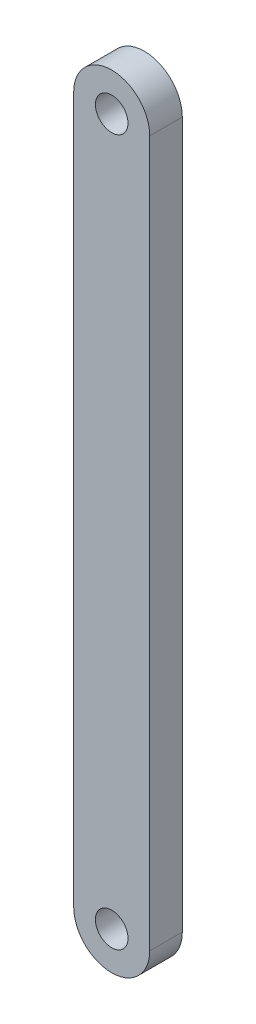
ISO-10303-21;
HEADER;
FILE_DESCRIPTION(('STEP AP214'),'2;1');
FILE_NAME('part.step','',(''),(''),'','','');
FILE_SCHEMA(('AUTOMOTIVE_DESIGN { 1 0 10303 214 1 1 1 1 }'));
ENDSEC;
DATA;
#1=APPLICATION_CONTEXT('core data for automotive mechanical design processes');
#2=APPLICATION_PROTOCOL_DEFINITION('international standard','automotive_design',2000,#1);
#3=PRODUCT_CONTEXT('',#1,'mechanical');
#4=PRODUCT('Part','Part','',(#3));
#5=PRODUCT_RELATED_PRODUCT_CATEGORY('part','',(#4));
#6=PRODUCT_DEFINITION_FORMATION('','',#4);
#7=PRODUCT_DEFINITION_CONTEXT('part definition',#1,'design');
#8=PRODUCT_DEFINITION('design','',#6,#7);
#9=PRODUCT_DEFINITION_SHAPE('','',#8);
#10=(LENGTH_UNIT() NAMED_UNIT(*) SI_UNIT(.MILLI.,.METRE.));
#11=(NAMED_UNIT(*) PLANE_ANGLE_UNIT() SI_UNIT($,.RADIAN.));
#12=(NAMED_UNIT(*) SI_UNIT($,.STERADIAN.) SOLID_ANGLE_UNIT());
#13=UNCERTAINTY_MEASURE_WITH_UNIT(LENGTH_MEASURE(1.E-05),#10,'distance_accuracy_value','');
#14=(GEOMETRIC_REPRESENTATION_CONTEXT(3) GLOBAL_UNCERTAINTY_ASSIGNED_CONTEXT((#13)) GLOBAL_UNIT_ASSIGNED_CONTEXT((#10,
#11,#12)) REPRESENTATION_CONTEXT('',''));
#15=CARTESIAN_POINT('',(0.,0.,0.));
#16=DIRECTION('',(0.,0.,1.));
#17=DIRECTION('',(1.,0.,0.));
#18=AXIS2_PLACEMENT_3D('',#15,#16,#17);
#19=CARTESIAN_POINT('',(0.,32.5,1.5));
#20=DIRECTION('',(0.,0.,1.));
#21=DIRECTION('',(1.,0.,0.));
#22=AXIS2_PLACEMENT_3D('',#19,#20,#21);
#23=PLANE('',#22);
#24=CARTESIAN_POINT('',(0.,-32.5,1.5));
#25=DIRECTION('',(0.,0.,1.));
#26=DIRECTION('',(1.,0.,0.));
#27=AXIS2_PLACEMENT_3D('',#24,#25,#26);
#28=CIRCLE('',#27,1.5);
#29=CARTESIAN_POINT('',(1.50000000000001,-32.5,1.5));
#30=VERTEX_POINT('',#29);
#31=EDGE_CURVE('E104',#30,#30,#28,.T.);
#32=ORIENTED_EDGE('',*,*,#31,.F.);
#33=EDGE_LOOP('',(#32));
#34=FACE_BOUND('',#33,.T.);
#35=CARTESIAN_POINT('',(0.,32.5,1.5));
#36=DIRECTION('',(0.,0.,1.));
#37=DIRECTION('',(1.,0.,0.));
#38=AXIS2_PLACEMENT_3D('',#35,#36,#37);
#39=CIRCLE('',#38,3.5);
#40=CARTESIAN_POINT('',(3.49999999999999,32.5,1.5));
#41=VERTEX_POINT('',#40);
#42=CARTESIAN_POINT('',(-3.50000000000001,32.5,1.5));
#43=VERTEX_POINT('',#42);
#44=EDGE_CURVE('E89',#41,#43,#39,.T.);
#45=ORIENTED_EDGE('',*,*,#44,.T.);
#46=DIRECTION('',(0.,-1.,0.));
#47=VECTOR('',#46,1.);
#48=CARTESIAN_POINT('',(-3.50000000000001,32.5,1.5));
#49=LINE('',#48,#47);
#50=CARTESIAN_POINT('',(-3.49999999999999,-32.5,1.5));
#51=VERTEX_POINT('',#50);
#52=EDGE_CURVE('E84',#43,#51,#49,.T.);
#53=ORIENTED_EDGE('',*,*,#52,.T.);
#54=CARTESIAN_POINT('',(0.,-32.5,1.5));
#55=DIRECTION('',(0.,0.,1.));
#56=DIRECTION('',(1.,0.,0.));
#57=AXIS2_PLACEMENT_3D('',#54,#55,#56);
#58=CIRCLE('',#57,3.5);
#59=CARTESIAN_POINT('',(3.50000000000001,-32.5,1.5));
#60=VERTEX_POINT('',#59);
#61=EDGE_CURVE('E87',#51,#60,#58,.T.);
#62=ORIENTED_EDGE('',*,*,#61,.T.);
#63=DIRECTION('',(0.,1.,0.));
#64=VECTOR('',#63,1.);
#65=CARTESIAN_POINT('',(3.49999999999999,32.5,1.5));
#66=LINE('',#65,#64);
#67=EDGE_CURVE('E54',#60,#41,#66,.T.);
#68=ORIENTED_EDGE('',*,*,#67,.T.);
#69=EDGE_LOOP('',(#45,#53,#62,#68));
#70=FACE_BOUND('',#69,.T.);
#71=CARTESIAN_POINT('',(0.,32.5,1.5));
#72=DIRECTION('',(0.,0.,1.));
#73=DIRECTION('',(1.,0.,0.));
#74=AXIS2_PLACEMENT_3D('',#71,#72,#73);
#75=CIRCLE('',#74,1.5);
#76=CARTESIAN_POINT('',(1.49999999999999,32.5,1.5));
#77=VERTEX_POINT('',#76);
#78=EDGE_CURVE('E119',#77,#77,#75,.T.);
#79=ORIENTED_EDGE('',*,*,#78,.F.);
#80=EDGE_LOOP('',(#79));
#81=FACE_BOUND('',#80,.T.);
#82=ADVANCED_FACE('F37',(#34,#70,#81),#23,.T.);
#83=CARTESIAN_POINT('',(0.,32.5,-1.5));
#84=DIRECTION('',(0.,0.,1.));
#85=DIRECTION('',(1.,0.,0.));
#86=AXIS2_PLACEMENT_3D('',#83,#84,#85);
#87=PLANE('',#86);
#88=CARTESIAN_POINT('',(0.,32.5,-1.5));
#89=DIRECTION('',(0.,0.,1.));
#90=DIRECTION('',(1.,0.,0.));
#91=AXIS2_PLACEMENT_3D('',#88,#89,#90);
#92=CIRCLE('',#91,3.5);
#93=CARTESIAN_POINT('',(3.49999999999999,32.5,-1.5));
#94=VERTEX_POINT('',#93);
#95=CARTESIAN_POINT('',(-3.50000000000001,32.5,-1.5));
#96=VERTEX_POINT('',#95);
#97=EDGE_CURVE('E101',#94,#96,#92,.T.);
#98=ORIENTED_EDGE('',*,*,#97,.F.);
#99=DIRECTION('',(0.,1.,0.));
#100=VECTOR('',#99,1.);
#101=CARTESIAN_POINT('',(3.49999999999999,32.5,-1.5));
#102=LINE('',#101,#100);
#103=CARTESIAN_POINT('',(3.50000000000001,-32.5,-1.5));
#104=VERTEX_POINT('',#103);
#105=EDGE_CURVE('E77',#104,#94,#102,.T.);
#106=ORIENTED_EDGE('',*,*,#105,.F.);
#107=CARTESIAN_POINT('',(0.,-32.5,-1.5));
#108=DIRECTION('',(0.,0.,1.));
#109=DIRECTION('',(1.,0.,0.));
#110=AXIS2_PLACEMENT_3D('',#107,#108,#109);
#111=CIRCLE('',#110,3.5);
#112=CARTESIAN_POINT('',(-3.49999999999999,-32.5,-1.5));
#113=VERTEX_POINT('',#112);
#114=EDGE_CURVE('E71',#113,#104,#111,.T.);
#115=ORIENTED_EDGE('',*,*,#114,.F.);
#116=DIRECTION('',(0.,-1.,0.));
#117=VECTOR('',#116,1.);
#118=CARTESIAN_POINT('',(-3.50000000000001,32.5,-1.5));
#119=LINE('',#118,#117);
#120=EDGE_CURVE('E93',#96,#113,#119,.T.);
#121=ORIENTED_EDGE('',*,*,#120,.F.);
#122=EDGE_LOOP('',(#98,#106,#115,#121));
#123=FACE_BOUND('',#122,.T.);
#124=CARTESIAN_POINT('',(0.,-32.5,-1.5));
#125=DIRECTION('',(0.,0.,1.));
#126=DIRECTION('',(1.,0.,0.));
#127=AXIS2_PLACEMENT_3D('',#124,#125,#126);
#128=CIRCLE('',#127,1.5);
#129=CARTESIAN_POINT('',(1.50000000000001,-32.5,-1.5));
#130=VERTEX_POINT('',#129);
#131=EDGE_CURVE('E116',#130,#130,#128,.T.);
#132=ORIENTED_EDGE('',*,*,#131,.T.);
#133=EDGE_LOOP('',(#132));
#134=FACE_BOUND('',#133,.T.);
#135=CARTESIAN_POINT('',(0.,32.5,-1.5));
#136=DIRECTION('',(0.,0.,1.));
#137=DIRECTION('',(1.,0.,0.));
#138=AXIS2_PLACEMENT_3D('',#135,#136,#137);
#139=CIRCLE('',#138,1.5);
#140=CARTESIAN_POINT('',(1.49999999999999,32.5,-1.5));
#141=VERTEX_POINT('',#140);
#142=EDGE_CURVE('E122',#141,#141,#139,.T.);
#143=ORIENTED_EDGE('',*,*,#142,.T.);
#144=EDGE_LOOP('',(#143));
#145=FACE_BOUND('',#144,.T.);
#146=ADVANCED_FACE('F112',(#123,#134,#145),#87,.F.);
#147=CARTESIAN_POINT('',(0.,32.5,1.5));
#148=DIRECTION('',(0.,0.,-1.));
#149=DIRECTION('',(-1.,0.,0.));
#150=AXIS2_PLACEMENT_3D('',#147,#148,#149);
#151=CYLINDRICAL_SURFACE('',#150,3.5);
#152=ORIENTED_EDGE('',*,*,#97,.T.);
#153=DIRECTION('',(0.,0.,-1.));
#154=VECTOR('',#153,1.);
#155=CARTESIAN_POINT('',(-3.50000000000001,32.5,1.5));
#156=LINE('',#155,#154);
#157=EDGE_CURVE('E11',#43,#96,#156,.T.);
#158=ORIENTED_EDGE('',*,*,#157,.F.);
#159=ORIENTED_EDGE('',*,*,#44,.F.);
#160=DIRECTION('',(0.,0.,-1.));
#161=VECTOR('',#160,1.);
#162=CARTESIAN_POINT('',(3.49999999999999,32.5,1.5));
#163=LINE('',#162,#161);
#164=EDGE_CURVE('E97',#41,#94,#163,.T.);
#165=ORIENTED_EDGE('',*,*,#164,.T.);
#166=EDGE_LOOP('',(#152,#158,#159,#165));
#167=FACE_BOUND('',#166,.T.);
#168=ADVANCED_FACE('F39',(#167),#151,.T.);
#169=CARTESIAN_POINT('',(-3.50000000000001,32.5,1.5));
#170=DIRECTION('',(1.,0.,0.));
#171=DIRECTION('',(0.,1.,0.));
#172=AXIS2_PLACEMENT_3D('',#169,#170,#171);
#173=PLANE('',#172);
#174=ORIENTED_EDGE('',*,*,#120,.T.);
#175=DIRECTION('',(0.,0.,-1.));
#176=VECTOR('',#175,1.);
#177=CARTESIAN_POINT('',(-3.49999999999999,-32.5,1.5));
#178=LINE('',#177,#176);
#179=EDGE_CURVE('E46',#51,#113,#178,.T.);
#180=ORIENTED_EDGE('',*,*,#179,.F.);
#181=ORIENTED_EDGE('',*,*,#52,.F.);
#182=ORIENTED_EDGE('',*,*,#157,.T.);
#183=EDGE_LOOP('',(#174,#180,#181,#182));
#184=FACE_BOUND('',#183,.T.);
#185=ADVANCED_FACE('F92',(#184),#173,.F.);
#186=CARTESIAN_POINT('',(0.,-32.5,1.5));
#187=DIRECTION('',(0.,0.,-1.));
#188=DIRECTION('',(-1.,0.,0.));
#189=AXIS2_PLACEMENT_3D('',#186,#187,#188);
#190=CYLINDRICAL_SURFACE('',#189,3.5);
#191=ORIENTED_EDGE('',*,*,#114,.T.);
#192=DIRECTION('',(0.,0.,-1.));
#193=VECTOR('',#192,1.);
#194=CARTESIAN_POINT('',(3.50000000000001,-32.5,1.5));
#195=LINE('',#194,#193);
#196=EDGE_CURVE('E94',#60,#104,#195,.T.);
#197=ORIENTED_EDGE('',*,*,#196,.F.);
#198=ORIENTED_EDGE('',*,*,#61,.F.);
#199=ORIENTED_EDGE('',*,*,#179,.T.);
#200=EDGE_LOOP('',(#191,#197,#198,#199));
#201=FACE_BOUND('',#200,.T.);
#202=ADVANCED_FACE('F95',(#201),#190,.T.);
#203=CARTESIAN_POINT('',(3.49999999999999,32.5,1.5));
#204=DIRECTION('',(-1.,0.,0.));
#205=DIRECTION('',(0.,-1.,0.));
#206=AXIS2_PLACEMENT_3D('',#203,#204,#205);
#207=PLANE('',#206);
#208=ORIENTED_EDGE('',*,*,#105,.T.);
#209=ORIENTED_EDGE('',*,*,#164,.F.);
#210=ORIENTED_EDGE('',*,*,#67,.F.);
#211=ORIENTED_EDGE('',*,*,#196,.T.);
#212=EDGE_LOOP('',(#208,#209,#210,#211));
#213=FACE_BOUND('',#212,.T.);
#214=ADVANCED_FACE('F109',(#213),#207,.F.);
#215=CARTESIAN_POINT('',(0.,-32.5,1.5));
#216=DIRECTION('',(0.,0.,-1.));
#217=DIRECTION('',(-1.,0.,0.));
#218=AXIS2_PLACEMENT_3D('',#215,#216,#217);
#219=CYLINDRICAL_SURFACE('',#218,1.5);
#220=ORIENTED_EDGE('',*,*,#31,.T.);
#221=EDGE_LOOP('',(#220));
#222=FACE_BOUND('',#221,.T.);
#223=ORIENTED_EDGE('',*,*,#131,.F.);
#224=EDGE_LOOP('',(#223));
#225=FACE_BOUND('',#224,.T.);
#226=ADVANCED_FACE('F139',(#222,#225),#219,.F.);
#227=CARTESIAN_POINT('',(0.,32.5,1.5));
#228=DIRECTION('',(0.,0.,-1.));
#229=DIRECTION('',(-1.,0.,0.));
#230=AXIS2_PLACEMENT_3D('',#227,#228,#229);
#231=CYLINDRICAL_SURFACE('',#230,1.5);
#232=ORIENTED_EDGE('',*,*,#78,.T.);
#233=EDGE_LOOP('',(#232));
#234=FACE_BOUND('',#233,.T.);
#235=ORIENTED_EDGE('',*,*,#142,.F.);
#236=EDGE_LOOP('',(#235));
#237=FACE_BOUND('',#236,.T.);
#238=ADVANCED_FACE('F128',(#234,#237),#231,.F.);
#239=CLOSED_SHELL('',(#82,#146,#168,#185,#202,#214,#226,#238));
#240=MANIFOLD_SOLID_BREP('B2',#239);
#241=ADVANCED_BREP_SHAPE_REPRESENTATION('',(#18,#240),#14);
#242=SHAPE_DEFINITION_REPRESENTATION(#9,#241);
ENDSEC;
END-ISO-10303-21;
